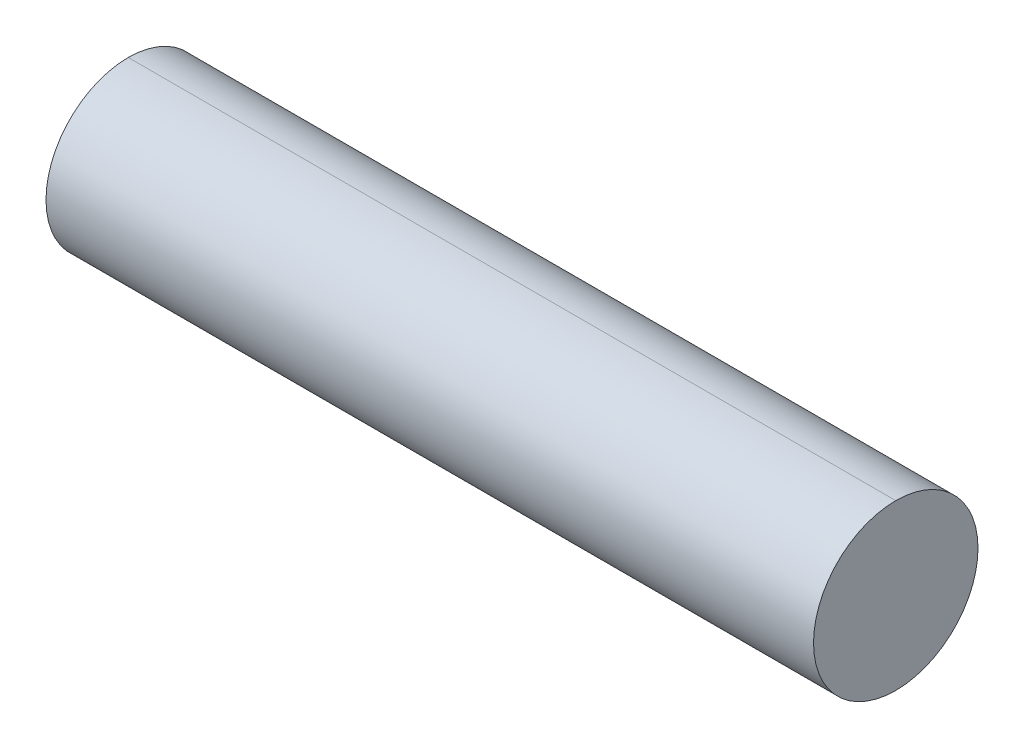
ISO-10303-21;
HEADER;
FILE_DESCRIPTION(('STEP AP214'),'2;1');
FILE_NAME('part.step','',(''),(''),'','','');
FILE_SCHEMA(('AUTOMOTIVE_DESIGN { 1 0 10303 214 1 1 1 1 }'));
ENDSEC;
DATA;
#1=APPLICATION_CONTEXT('core data for automotive mechanical design processes');
#2=APPLICATION_PROTOCOL_DEFINITION('international standard','automotive_design',2000,#1);
#3=PRODUCT_CONTEXT('',#1,'mechanical');
#4=PRODUCT('Part','Part','',(#3));
#5=PRODUCT_RELATED_PRODUCT_CATEGORY('part','',(#4));
#6=PRODUCT_DEFINITION_FORMATION('','',#4);
#7=PRODUCT_DEFINITION_CONTEXT('part definition',#1,'design');
#8=PRODUCT_DEFINITION('design','',#6,#7);
#9=PRODUCT_DEFINITION_SHAPE('','',#8);
#10=(LENGTH_UNIT() NAMED_UNIT(*) SI_UNIT(.MILLI.,.METRE.));
#11=(NAMED_UNIT(*) PLANE_ANGLE_UNIT() SI_UNIT($,.RADIAN.));
#12=(NAMED_UNIT(*) SI_UNIT($,.STERADIAN.) SOLID_ANGLE_UNIT());
#13=UNCERTAINTY_MEASURE_WITH_UNIT(LENGTH_MEASURE(1.E-05),#10,'distance_accuracy_value','');
#14=(GEOMETRIC_REPRESENTATION_CONTEXT(3) GLOBAL_UNCERTAINTY_ASSIGNED_CONTEXT((#13)) GLOBAL_UNIT_ASSIGNED_CONTEXT((#10,
#11,#12)) REPRESENTATION_CONTEXT('',''));
#15=CARTESIAN_POINT('',(0.,0.,0.));
#16=DIRECTION('',(0.,0.,1.));
#17=DIRECTION('',(1.,0.,0.));
#18=AXIS2_PLACEMENT_3D('',#15,#16,#17);
#19=CARTESIAN_POINT('',(341.376,0.,0.));
#20=DIRECTION('',(-1.,0.,0.));
#21=DIRECTION('',(0.,0.,1.));
#22=AXIS2_PLACEMENT_3D('',#19,#20,#21);
#23=CYLINDRICAL_SURFACE('',#22,54.102);
#24=CARTESIAN_POINT('',(341.376,0.,0.));
#25=DIRECTION('',(1.,0.,0.));
#26=DIRECTION('',(0.,0.,-1.));
#27=AXIS2_PLACEMENT_3D('',#24,#25,#26);
#28=CIRCLE('',#27,54.102);
#29=CARTESIAN_POINT('',(341.376,-54.102,0.));
#30=VERTEX_POINT('',#29);
#31=CARTESIAN_POINT('',(341.376,54.102,0.));
#32=VERTEX_POINT('',#31);
#33=EDGE_CURVE('E71',#30,#32,#28,.T.);
#34=ORIENTED_EDGE('',*,*,#33,.F.);
#35=DIRECTION('',(-1.,0.,0.));
#36=VECTOR('',#35,1.);
#37=CARTESIAN_POINT('',(341.376,-54.102,0.));
#38=LINE('',#37,#36);
#39=CARTESIAN_POINT('',(-163.576,-54.102,0.));
#40=VERTEX_POINT('',#39);
#41=EDGE_CURVE('E11',#30,#40,#38,.T.);
#42=ORIENTED_EDGE('',*,*,#41,.T.);
#43=CARTESIAN_POINT('',(-163.576,0.,0.));
#44=DIRECTION('',(1.,0.,0.));
#45=DIRECTION('',(0.,0.,-1.));
#46=AXIS2_PLACEMENT_3D('',#43,#44,#45);
#47=CIRCLE('',#46,54.102);
#48=CARTESIAN_POINT('',(-163.576,54.102,0.));
#49=VERTEX_POINT('',#48);
#50=EDGE_CURVE('E78',#40,#49,#47,.T.);
#51=ORIENTED_EDGE('',*,*,#50,.T.);
#52=DIRECTION('',(1.,0.,0.));
#53=VECTOR('',#52,1.);
#54=CARTESIAN_POINT('',(341.376,54.102,0.));
#55=LINE('',#54,#53);
#56=EDGE_CURVE('E54',#49,#32,#55,.T.);
#57=ORIENTED_EDGE('',*,*,#56,.T.);
#58=EDGE_LOOP('',(#34,#42,#51,#57));
#59=FACE_BOUND('',#58,.T.);
#60=ADVANCED_FACE('F45',(#59),#23,.T.);
#61=ORIENTED_EDGE('',*,*,#41,.F.);
#62=EDGE_CURVE('E74',#32,#30,#28,.T.);
#63=ORIENTED_EDGE('',*,*,#62,.F.);
#64=ORIENTED_EDGE('',*,*,#56,.F.);
#65=EDGE_CURVE('E75',#49,#40,#47,.T.);
#66=ORIENTED_EDGE('',*,*,#65,.T.);
#67=EDGE_LOOP('',(#61,#63,#64,#66));
#68=FACE_BOUND('',#67,.T.);
#69=ADVANCED_FACE('F47',(#68),#23,.T.);
#70=CARTESIAN_POINT('',(341.376,0.,0.));
#71=DIRECTION('',(1.,0.,0.));
#72=DIRECTION('',(0.,0.,-1.));
#73=AXIS2_PLACEMENT_3D('',#70,#71,#72);
#74=PLANE('',#73);
#75=ORIENTED_EDGE('',*,*,#62,.T.);
#76=ORIENTED_EDGE('',*,*,#33,.T.);
#77=EDGE_LOOP('',(#75,#76));
#78=FACE_BOUND('',#77,.T.);
#79=ADVANCED_FACE('F73',(#78),#74,.T.);
#80=CARTESIAN_POINT('',(-163.576,0.,0.));
#81=DIRECTION('',(1.,0.,0.));
#82=DIRECTION('',(0.,0.,-1.));
#83=AXIS2_PLACEMENT_3D('',#80,#81,#82);
#84=PLANE('',#83);
#85=ORIENTED_EDGE('',*,*,#65,.F.);
#86=ORIENTED_EDGE('',*,*,#50,.F.);
#87=EDGE_LOOP('',(#85,#86));
#88=FACE_BOUND('',#87,.T.);
#89=ADVANCED_FACE('F83',(#88),#84,.F.);
#90=CLOSED_SHELL('',(#60,#69,#79,#89));
#91=MANIFOLD_SOLID_BREP('B2',#90);
#92=ADVANCED_BREP_SHAPE_REPRESENTATION('',(#18,#91),#14);
#93=SHAPE_DEFINITION_REPRESENTATION(#9,#92);
ENDSEC;
END-ISO-10303-21;
